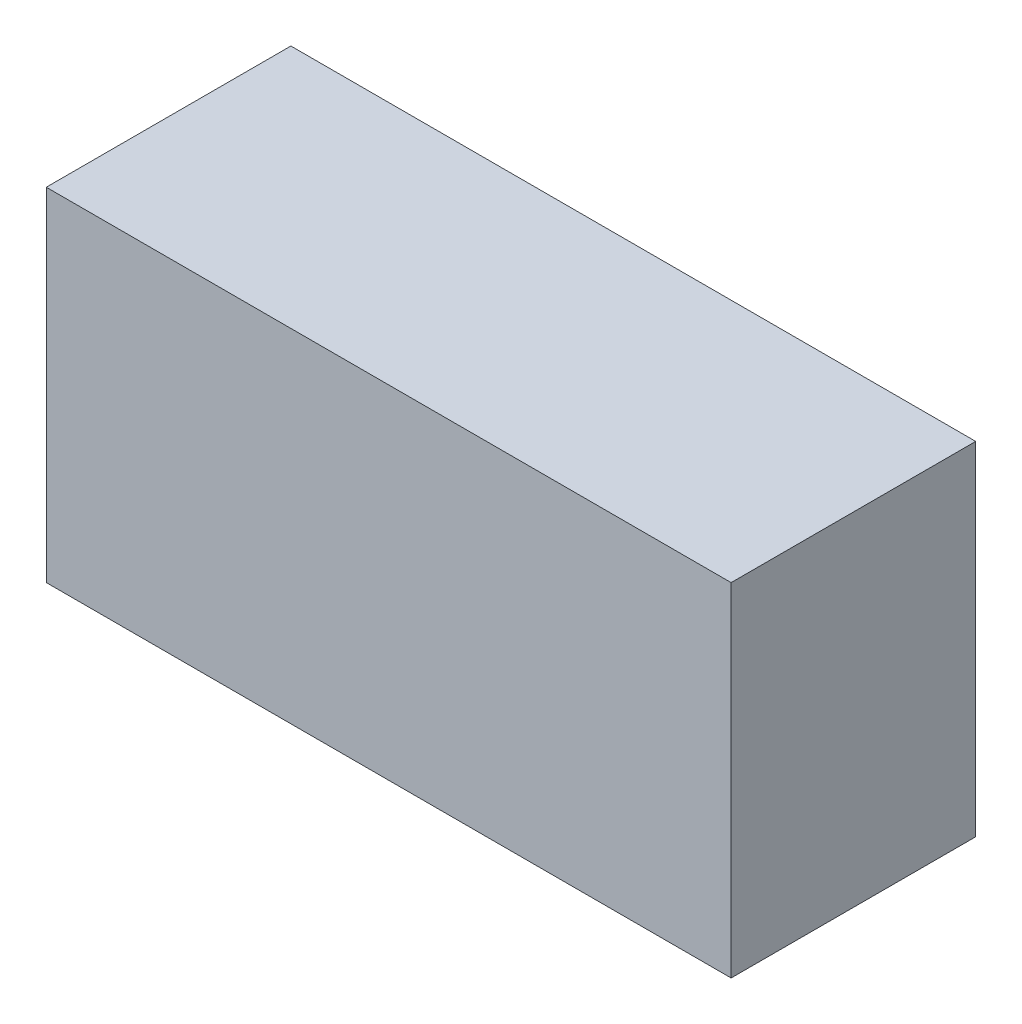
ISO-10303-21;
HEADER;
FILE_DESCRIPTION(('STEP AP214'),'2;1');
FILE_NAME('part.step','',(''),(''),'','','');
FILE_SCHEMA(('AUTOMOTIVE_DESIGN { 1 0 10303 214 1 1 1 1 }'));
ENDSEC;
DATA;
#1=APPLICATION_CONTEXT('core data for automotive mechanical design processes');
#2=APPLICATION_PROTOCOL_DEFINITION('international standard','automotive_design',2000,#1);
#3=PRODUCT_CONTEXT('',#1,'mechanical');
#4=PRODUCT('Part','Part','',(#3));
#5=PRODUCT_RELATED_PRODUCT_CATEGORY('part','',(#4));
#6=PRODUCT_DEFINITION_FORMATION('','',#4);
#7=PRODUCT_DEFINITION_CONTEXT('part definition',#1,'design');
#8=PRODUCT_DEFINITION('design','',#6,#7);
#9=PRODUCT_DEFINITION_SHAPE('','',#8);
#10=(LENGTH_UNIT() NAMED_UNIT(*) SI_UNIT(.MILLI.,.METRE.));
#11=(NAMED_UNIT(*) PLANE_ANGLE_UNIT() SI_UNIT($,.RADIAN.));
#12=(NAMED_UNIT(*) SI_UNIT($,.STERADIAN.) SOLID_ANGLE_UNIT());
#13=UNCERTAINTY_MEASURE_WITH_UNIT(LENGTH_MEASURE(1.E-05),#10,'distance_accuracy_value','');
#14=(GEOMETRIC_REPRESENTATION_CONTEXT(3) GLOBAL_UNCERTAINTY_ASSIGNED_CONTEXT((#13)) GLOBAL_UNIT_ASSIGNED_CONTEXT((#10,
#11,#12)) REPRESENTATION_CONTEXT('',''));
#15=CARTESIAN_POINT('',(0.,0.,0.));
#16=DIRECTION('',(0.,0.,1.));
#17=DIRECTION('',(1.,0.,0.));
#18=AXIS2_PLACEMENT_3D('',#15,#16,#17);
#19=CARTESIAN_POINT('',(0.,0.,25.));
#20=DIRECTION('',(1.,0.,0.));
#21=DIRECTION('',(0.,1.,0.));
#22=AXIS2_PLACEMENT_3D('',#19,#20,#21);
#23=PLANE('',#22);
#24=DIRECTION('',(0.,-1.,0.));
#25=VECTOR('',#24,1.);
#26=CARTESIAN_POINT('',(0.,0.,0.));
#27=LINE('',#26,#25);
#28=CARTESIAN_POINT('',(0.,0.,0.));
#29=VERTEX_POINT('',#28);
#30=CARTESIAN_POINT('',(0.,-35.,0.));
#31=VERTEX_POINT('',#30);
#32=EDGE_CURVE('E113',#29,#31,#27,.T.);
#33=ORIENTED_EDGE('',*,*,#32,.T.);
#34=DIRECTION('',(0.,0.,-1.));
#35=VECTOR('',#34,1.);
#36=CARTESIAN_POINT('',(0.,-35.,25.));
#37=LINE('',#36,#35);
#38=CARTESIAN_POINT('',(0.,-35.,25.));
#39=VERTEX_POINT('',#38);
#40=EDGE_CURVE('E11',#39,#31,#37,.T.);
#41=ORIENTED_EDGE('',*,*,#40,.F.);
#42=DIRECTION('',(0.,-1.,0.));
#43=VECTOR('',#42,1.);
#44=CARTESIAN_POINT('',(0.,0.,25.));
#45=LINE('',#44,#43);
#46=CARTESIAN_POINT('',(0.,0.,25.));
#47=VERTEX_POINT('',#46);
#48=EDGE_CURVE('E97',#47,#39,#45,.T.);
#49=ORIENTED_EDGE('',*,*,#48,.F.);
#50=DIRECTION('',(0.,0.,-1.));
#51=VECTOR('',#50,1.);
#52=CARTESIAN_POINT('',(0.,0.,25.));
#53=LINE('',#52,#51);
#54=EDGE_CURVE('E109',#47,#29,#53,.T.);
#55=ORIENTED_EDGE('',*,*,#54,.T.);
#56=EDGE_LOOP('',(#33,#41,#49,#55));
#57=FACE_BOUND('',#56,.T.);
#58=ADVANCED_FACE('F45',(#57),#23,.F.);
#59=CARTESIAN_POINT('',(0.,-35.,25.));
#60=DIRECTION('',(0.,1.,0.));
#61=DIRECTION('',(0.,0.,1.));
#62=AXIS2_PLACEMENT_3D('',#59,#60,#61);
#63=PLANE('',#62);
#64=DIRECTION('',(1.,0.,0.));
#65=VECTOR('',#64,1.);
#66=CARTESIAN_POINT('',(0.,-35.,0.));
#67=LINE('',#66,#65);
#68=CARTESIAN_POINT('',(70.,-35.,0.));
#69=VERTEX_POINT('',#68);
#70=EDGE_CURVE('E102',#31,#69,#67,.T.);
#71=ORIENTED_EDGE('',*,*,#70,.T.);
#72=DIRECTION('',(0.,0.,-1.));
#73=VECTOR('',#72,1.);
#74=CARTESIAN_POINT('',(70.,-35.,25.));
#75=LINE('',#74,#73);
#76=CARTESIAN_POINT('',(70.,-35.,25.));
#77=VERTEX_POINT('',#76);
#78=EDGE_CURVE('E54',#77,#69,#75,.T.);
#79=ORIENTED_EDGE('',*,*,#78,.F.);
#80=DIRECTION('',(1.,0.,0.));
#81=VECTOR('',#80,1.);
#82=CARTESIAN_POINT('',(0.,-35.,25.));
#83=LINE('',#82,#81);
#84=EDGE_CURVE('E92',#39,#77,#83,.T.);
#85=ORIENTED_EDGE('',*,*,#84,.F.);
#86=ORIENTED_EDGE('',*,*,#40,.T.);
#87=EDGE_LOOP('',(#71,#79,#85,#86));
#88=FACE_BOUND('',#87,.T.);
#89=ADVANCED_FACE('F101',(#88),#63,.F.);
#90=CARTESIAN_POINT('',(70.,0.,25.));
#91=DIRECTION('',(-1.,0.,0.));
#92=DIRECTION('',(0.,0.,1.));
#93=AXIS2_PLACEMENT_3D('',#90,#91,#92);
#94=PLANE('',#93);
#95=DIRECTION('',(0.,1.,0.));
#96=VECTOR('',#95,1.);
#97=CARTESIAN_POINT('',(70.,0.,0.));
#98=LINE('',#97,#96);
#99=CARTESIAN_POINT('',(70.,0.,0.));
#100=VERTEX_POINT('',#99);
#101=EDGE_CURVE('E79',#69,#100,#98,.T.);
#102=ORIENTED_EDGE('',*,*,#101,.T.);
#103=DIRECTION('',(0.,0.,-1.));
#104=VECTOR('',#103,1.);
#105=CARTESIAN_POINT('',(70.,0.,25.));
#106=LINE('',#105,#104);
#107=CARTESIAN_POINT('',(70.,0.,25.));
#108=VERTEX_POINT('',#107);
#109=EDGE_CURVE('E104',#108,#100,#106,.T.);
#110=ORIENTED_EDGE('',*,*,#109,.F.);
#111=DIRECTION('',(0.,1.,0.));
#112=VECTOR('',#111,1.);
#113=CARTESIAN_POINT('',(70.,0.,25.));
#114=LINE('',#113,#112);
#115=EDGE_CURVE('E95',#77,#108,#114,.T.);
#116=ORIENTED_EDGE('',*,*,#115,.F.);
#117=ORIENTED_EDGE('',*,*,#78,.T.);
#118=EDGE_LOOP('',(#102,#110,#116,#117));
#119=FACE_BOUND('',#118,.T.);
#120=ADVANCED_FACE('F105',(#119),#94,.F.);
#121=CARTESIAN_POINT('',(0.,0.,25.));
#122=DIRECTION('',(0.,-1.,0.));
#123=DIRECTION('',(0.,0.,-1.));
#124=AXIS2_PLACEMENT_3D('',#121,#122,#123);
#125=PLANE('',#124);
#126=DIRECTION('',(-1.,0.,0.));
#127=VECTOR('',#126,1.);
#128=CARTESIAN_POINT('',(0.,0.,0.));
#129=LINE('',#128,#127);
#130=EDGE_CURVE('E85',#100,#29,#129,.T.);
#131=ORIENTED_EDGE('',*,*,#130,.T.);
#132=ORIENTED_EDGE('',*,*,#54,.F.);
#133=DIRECTION('',(-1.,0.,0.));
#134=VECTOR('',#133,1.);
#135=CARTESIAN_POINT('',(0.,0.,25.));
#136=LINE('',#135,#134);
#137=EDGE_CURVE('E62',#108,#47,#136,.T.);
#138=ORIENTED_EDGE('',*,*,#137,.F.);
#139=ORIENTED_EDGE('',*,*,#109,.T.);
#140=EDGE_LOOP('',(#131,#132,#138,#139));
#141=FACE_BOUND('',#140,.T.);
#142=ADVANCED_FACE('F126',(#141),#125,.F.);
#143=CARTESIAN_POINT('',(0.,0.,25.));
#144=DIRECTION('',(0.,0.,1.));
#145=DIRECTION('',(1.,0.,0.));
#146=AXIS2_PLACEMENT_3D('',#143,#144,#145);
#147=PLANE('',#146);
#148=ORIENTED_EDGE('',*,*,#48,.T.);
#149=ORIENTED_EDGE('',*,*,#84,.T.);
#150=ORIENTED_EDGE('',*,*,#115,.T.);
#151=ORIENTED_EDGE('',*,*,#137,.T.);
#152=EDGE_LOOP('',(#148,#149,#150,#151));
#153=FACE_BOUND('',#152,.T.);
#154=ADVANCED_FACE('F93',(#153),#147,.T.);
#155=CARTESIAN_POINT('',(0.,0.,0.));
#156=DIRECTION('',(0.,0.,1.));
#157=DIRECTION('',(1.,0.,0.));
#158=AXIS2_PLACEMENT_3D('',#155,#156,#157);
#159=PLANE('',#158);
#160=ORIENTED_EDGE('',*,*,#32,.F.);
#161=ORIENTED_EDGE('',*,*,#130,.F.);
#162=ORIENTED_EDGE('',*,*,#101,.F.);
#163=ORIENTED_EDGE('',*,*,#70,.F.);
#164=EDGE_LOOP('',(#160,#161,#162,#163));
#165=FACE_BOUND('',#164,.T.);
#166=ADVANCED_FACE('F129',(#165),#159,.F.);
#167=CLOSED_SHELL('',(#58,#89,#120,#142,#154,#166));
#168=MANIFOLD_SOLID_BREP('B2',#167);
#169=ADVANCED_BREP_SHAPE_REPRESENTATION('',(#18,#168),#14);
#170=SHAPE_DEFINITION_REPRESENTATION(#9,#169);
ENDSEC;
END-ISO-10303-21;
